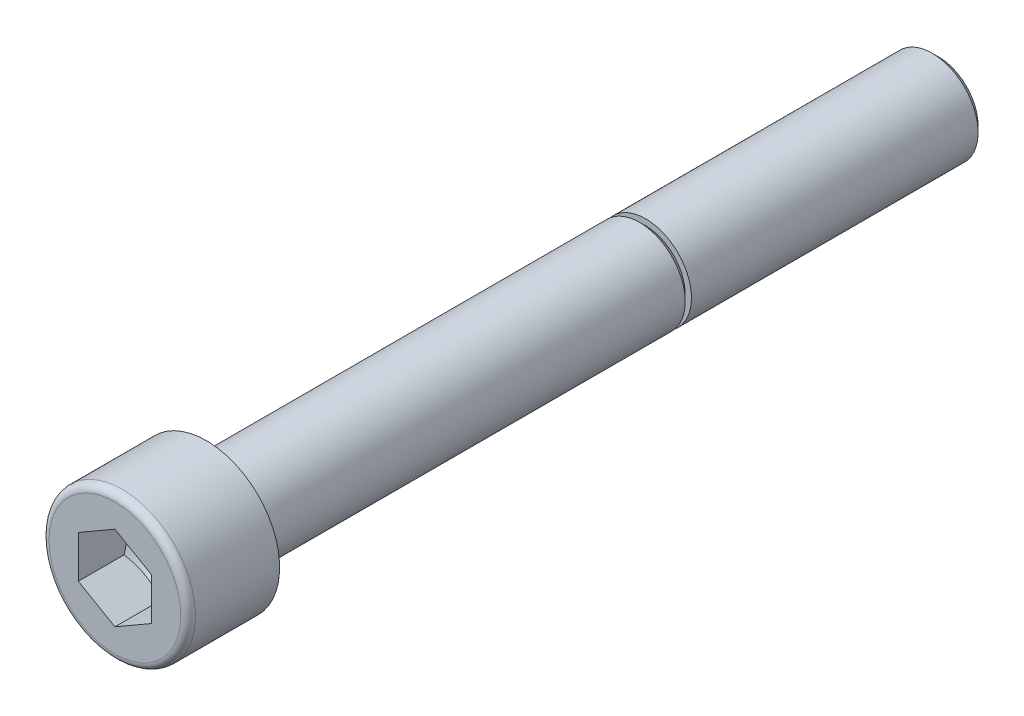
ISO-10303-21;
HEADER;
FILE_DESCRIPTION(('STEP AP214'),'2;1');
FILE_NAME('part.step','',(''),(''),'','','');
FILE_SCHEMA(('AUTOMOTIVE_DESIGN { 1 0 10303 214 1 1 1 1 }'));
ENDSEC;
DATA;
#1=APPLICATION_CONTEXT('core data for automotive mechanical design processes');
#2=APPLICATION_PROTOCOL_DEFINITION('international standard','automotive_design',2000,#1);
#3=PRODUCT_CONTEXT('',#1,'mechanical');
#4=PRODUCT('Part','Part','',(#3));
#5=PRODUCT_RELATED_PRODUCT_CATEGORY('part','',(#4));
#6=PRODUCT_DEFINITION_FORMATION('','',#4);
#7=PRODUCT_DEFINITION_CONTEXT('part definition',#1,'design');
#8=PRODUCT_DEFINITION('design','',#6,#7);
#9=PRODUCT_DEFINITION_SHAPE('','',#8);
#10=(LENGTH_UNIT() NAMED_UNIT(*) SI_UNIT(.MILLI.,.METRE.));
#11=(NAMED_UNIT(*) PLANE_ANGLE_UNIT() SI_UNIT($,.RADIAN.));
#12=(NAMED_UNIT(*) SI_UNIT($,.STERADIAN.) SOLID_ANGLE_UNIT());
#13=UNCERTAINTY_MEASURE_WITH_UNIT(LENGTH_MEASURE(1.E-05),#10,'distance_accuracy_value','');
#14=(GEOMETRIC_REPRESENTATION_CONTEXT(3) GLOBAL_UNCERTAINTY_ASSIGNED_CONTEXT((#13)) GLOBAL_UNIT_ASSIGNED_CONTEXT((#10,
#11,#12)) REPRESENTATION_CONTEXT('',''));
#15=CARTESIAN_POINT('',(0.,0.,0.));
#16=DIRECTION('',(0.,0.,1.));
#17=DIRECTION('',(1.,0.,0.));
#18=AXIS2_PLACEMENT_3D('',#15,#16,#17);
#19=CARTESIAN_POINT('',(-4.,0.,0.));
#20=DIRECTION('',(0.,0.,-1.));
#21=DIRECTION('',(-1.,0.,0.));
#22=AXIS2_PLACEMENT_3D('',#19,#20,#21);
#23=PLANE('',#22);
#24=CARTESIAN_POINT('',(0.,0.,0.));
#25=DIRECTION('',(0.,0.,-1.));
#26=DIRECTION('',(-1.,0.,0.));
#27=AXIS2_PLACEMENT_3D('',#24,#25,#26);
#28=CIRCLE('',#27,8.);
#29=CARTESIAN_POINT('',(-8.,0.,0.));
#30=VERTEX_POINT('',#29);
#31=EDGE_CURVE('E11',#30,#30,#28,.T.);
#32=ORIENTED_EDGE('',*,*,#31,.T.);
#33=EDGE_LOOP('',(#32));
#34=FACE_BOUND('',#33,.T.);
#35=CARTESIAN_POINT('',(0.,0.,0.));
#36=DIRECTION('',(0.,0.,1.));
#37=DIRECTION('',(-1.,0.,0.));
#38=AXIS2_PLACEMENT_3D('',#35,#36,#37);
#39=CIRCLE('',#38,5.);
#40=CARTESIAN_POINT('',(5.,0.,0.));
#41=VERTEX_POINT('',#40);
#42=EDGE_CURVE('E146',#41,#41,#39,.T.);
#43=ORIENTED_EDGE('',*,*,#42,.T.);
#44=EDGE_LOOP('',(#43));
#45=FACE_BOUND('',#44,.T.);
#46=ADVANCED_FACE('F17',(#34,#45),#23,.T.);
#47=CARTESIAN_POINT('',(0.,0.,4.6));
#48=DIRECTION('',(0.,0.,1.));
#49=DIRECTION('',(-1.,0.,0.));
#50=AXIS2_PLACEMENT_3D('',#47,#48,#49);
#51=CYLINDRICAL_SURFACE('',#50,8.);
#52=CARTESIAN_POINT('',(0.,0.,9.2));
#53=DIRECTION('',(0.,0.,-1.));
#54=DIRECTION('',(-1.,0.,0.));
#55=AXIS2_PLACEMENT_3D('',#52,#53,#54);
#56=CIRCLE('',#55,8.);
#57=CARTESIAN_POINT('',(-8.,0.,9.2));
#58=VERTEX_POINT('',#57);
#59=EDGE_CURVE('E27',#58,#58,#56,.T.);
#60=ORIENTED_EDGE('',*,*,#59,.T.);
#61=EDGE_LOOP('',(#60));
#62=FACE_BOUND('',#61,.T.);
#63=ORIENTED_EDGE('',*,*,#31,.F.);
#64=EDGE_LOOP('',(#63));
#65=FACE_BOUND('',#64,.T.);
#66=ADVANCED_FACE('F220',(#62,#65),#51,.T.);
#67=CARTESIAN_POINT('',(0.,0.,9.2));
#68=DIRECTION('',(0.,0.,-1.));
#69=DIRECTION('',(0.,-1.,0.));
#70=AXIS2_PLACEMENT_3D('',#67,#68,#69);
#71=TOROIDAL_SURFACE('',#70,7.2,0.8);
#72=CARTESIAN_POINT('',(0.,0.,10.));
#73=DIRECTION('',(0.,0.,-1.));
#74=DIRECTION('',(-1.,0.,0.));
#75=AXIS2_PLACEMENT_3D('',#72,#73,#74);
#76=CIRCLE('',#75,7.2);
#77=CARTESIAN_POINT('',(-7.2,0.,10.));
#78=VERTEX_POINT('',#77);
#79=EDGE_CURVE('E165',#78,#78,#76,.T.);
#80=ORIENTED_EDGE('',*,*,#79,.T.);
#81=EDGE_LOOP('',(#80));
#82=FACE_BOUND('',#81,.T.);
#83=ORIENTED_EDGE('',*,*,#59,.F.);
#84=EDGE_LOOP('',(#83));
#85=FACE_BOUND('',#84,.T.);
#86=ADVANCED_FACE('F225',(#82,#85),#71,.T.);
#87=CARTESIAN_POINT('',(-3.6,0.,10.));
#88=DIRECTION('',(0.,0.,1.));
#89=DIRECTION('',(1.,0.,0.));
#90=AXIS2_PLACEMENT_3D('',#87,#88,#89);
#91=PLANE('',#90);
#92=ORIENTED_EDGE('',*,*,#79,.F.);
#93=EDGE_LOOP('',(#92));
#94=FACE_BOUND('',#93,.T.);
#95=DIRECTION('',(-0.866025403784439,-0.5,0.));
#96=VECTOR('',#95,1.);
#97=CARTESIAN_POINT('',(0.649999067499783,-4.24352286340599,10.));
#98=LINE('',#97,#96);
#99=CARTESIAN_POINT('',(3.99999813499956,-2.3094,10.));
#100=VERTEX_POINT('',#99);
#101=CARTESIAN_POINT('',(0.,-4.6188,10.));
#102=VERTEX_POINT('',#101);
#103=EDGE_CURVE('E108',#100,#102,#98,.T.);
#104=ORIENTED_EDGE('',*,*,#103,.T.);
#105=DIRECTION('',(-0.866025403784439,0.5,0.));
#106=VECTOR('',#105,1.);
#107=CARTESIAN_POINT('',(-3.34999906749979,-2.684677136594,10.));
#108=LINE('',#107,#106);
#109=CARTESIAN_POINT('',(-3.99999813499956,-2.3094,10.));
#110=VERTEX_POINT('',#109);
#111=EDGE_CURVE('E95',#102,#110,#108,.T.);
#112=ORIENTED_EDGE('',*,*,#111,.T.);
#113=DIRECTION('',(0.,1.,0.));
#114=VECTOR('',#113,1.);
#115=CARTESIAN_POINT('',(-3.99999813499956,0.,10.));
#116=LINE('',#115,#114);
#117=CARTESIAN_POINT('',(-3.99999813499956,2.3094,10.));
#118=VERTEX_POINT('',#117);
#119=EDGE_CURVE('E174',#110,#118,#116,.T.);
#120=ORIENTED_EDGE('',*,*,#119,.T.);
#121=DIRECTION('',(0.866025403784439,0.5,0.));
#122=VECTOR('',#121,1.);
#123=CARTESIAN_POINT('',(-3.34999906749978,2.684677136594,10.));
#124=LINE('',#123,#122);
#125=CARTESIAN_POINT('',(0.,4.6188,10.));
#126=VERTEX_POINT('',#125);
#127=EDGE_CURVE('E152',#118,#126,#124,.T.);
#128=ORIENTED_EDGE('',*,*,#127,.T.);
#129=DIRECTION('',(0.866025403784439,-0.5,0.));
#130=VECTOR('',#129,1.);
#131=CARTESIAN_POINT('',(0.649999067499783,4.24352286340599,10.));
#132=LINE('',#131,#130);
#133=CARTESIAN_POINT('',(3.99999813499956,2.3094,10.));
#134=VERTEX_POINT('',#133);
#135=EDGE_CURVE('E153',#126,#134,#132,.T.);
#136=ORIENTED_EDGE('',*,*,#135,.T.);
#137=DIRECTION('',(0.,-1.,0.));
#138=VECTOR('',#137,1.);
#139=CARTESIAN_POINT('',(3.99999813499956,0.,10.));
#140=LINE('',#139,#138);
#141=EDGE_CURVE('E110',#134,#100,#140,.T.);
#142=ORIENTED_EDGE('',*,*,#141,.T.);
#143=EDGE_LOOP('',(#104,#112,#120,#128,#136,#142));
#144=FACE_BOUND('',#143,.T.);
#145=ADVANCED_FACE('F19',(#94,#144),#91,.T.);
#146=CARTESIAN_POINT('',(-2.16171875,0.,-80.));
#147=DIRECTION('',(0.,0.,-1.));
#148=DIRECTION('',(-1.,0.,0.));
#149=AXIS2_PLACEMENT_3D('',#146,#147,#148);
#150=PLANE('',#149);
#151=CARTESIAN_POINT('',(0.,0.,-80.));
#152=DIRECTION('',(0.,0.,-1.));
#153=DIRECTION('',(-1.,0.,0.));
#154=AXIS2_PLACEMENT_3D('',#151,#152,#153);
#155=CIRCLE('',#154,4.3234375);
#156=CARTESIAN_POINT('',(-4.3234375,0.,-80.));
#157=VERTEX_POINT('',#156);
#158=EDGE_CURVE('E161',#157,#157,#155,.T.);
#159=ORIENTED_EDGE('',*,*,#158,.T.);
#160=EDGE_LOOP('',(#159));
#161=FACE_BOUND('',#160,.T.);
#162=ADVANCED_FACE('F285',(#161),#150,.T.);
#163=CARTESIAN_POINT('',(0.,0.,-79.66171875));
#164=DIRECTION('',(0.,0.,1.));
#165=DIRECTION('',(-1.,0.,0.));
#166=AXIS2_PLACEMENT_3D('',#163,#164,#165);
#167=CONICAL_SURFACE('',#166,4.66171875,0.785398163397446);
#168=CARTESIAN_POINT('',(0.,0.,-79.3234375));
#169=DIRECTION('',(0.,0.,-1.));
#170=DIRECTION('',(-1.,0.,0.));
#171=AXIS2_PLACEMENT_3D('',#168,#169,#170);
#172=CIRCLE('',#171,5.);
#173=CARTESIAN_POINT('',(-5.,0.,-79.3234375));
#174=VERTEX_POINT('',#173);
#175=EDGE_CURVE('E148',#174,#174,#172,.T.);
#176=ORIENTED_EDGE('',*,*,#175,.T.);
#177=EDGE_LOOP('',(#176));
#178=FACE_BOUND('',#177,.T.);
#179=ORIENTED_EDGE('',*,*,#158,.F.);
#180=EDGE_LOOP('',(#179));
#181=FACE_BOUND('',#180,.T.);
#182=ADVANCED_FACE('F281',(#178,#181),#167,.T.);
#183=CARTESIAN_POINT('',(0.,0.,-63.66171875));
#184=DIRECTION('',(0.,0.,1.));
#185=DIRECTION('',(-1.,0.,0.));
#186=AXIS2_PLACEMENT_3D('',#183,#184,#185);
#187=CYLINDRICAL_SURFACE('',#186,5.);
#188=CARTESIAN_POINT('',(0.,0.,-48.));
#189=DIRECTION('',(0.,0.,-1.));
#190=DIRECTION('',(-1.,0.,0.));
#191=AXIS2_PLACEMENT_3D('',#188,#189,#190);
#192=CIRCLE('',#191,5.);
#193=CARTESIAN_POINT('',(-5.,0.,-48.));
#194=VERTEX_POINT('',#193);
#195=EDGE_CURVE('E145',#194,#194,#192,.T.);
#196=ORIENTED_EDGE('',*,*,#195,.T.);
#197=EDGE_LOOP('',(#196));
#198=FACE_BOUND('',#197,.T.);
#199=ORIENTED_EDGE('',*,*,#175,.F.);
#200=EDGE_LOOP('',(#199));
#201=FACE_BOUND('',#200,.T.);
#202=ADVANCED_FACE('F284',(#198,#201),#187,.T.);
#203=CARTESIAN_POINT('',(-4.66171875,0.,-48.));
#204=DIRECTION('',(0.,0.,1.));
#205=DIRECTION('',(1.,0.,0.));
#206=AXIS2_PLACEMENT_3D('',#203,#204,#205);
#207=PLANE('',#206);
#208=CARTESIAN_POINT('',(0.,0.,-48.));
#209=DIRECTION('',(0.,0.,-1.));
#210=DIRECTION('',(-1.,0.,0.));
#211=AXIS2_PLACEMENT_3D('',#208,#209,#210);
#212=CIRCLE('',#211,4.3234375);
#213=CARTESIAN_POINT('',(-4.3234375,0.,-48.));
#214=VERTEX_POINT('',#213);
#215=EDGE_CURVE('E139',#214,#214,#212,.T.);
#216=ORIENTED_EDGE('',*,*,#215,.T.);
#217=EDGE_LOOP('',(#216));
#218=FACE_BOUND('',#217,.T.);
#219=ORIENTED_EDGE('',*,*,#195,.F.);
#220=EDGE_LOOP('',(#219));
#221=FACE_BOUND('',#220,.T.);
#222=ADVANCED_FACE('F231',(#218,#221),#207,.T.);
#223=CARTESIAN_POINT('',(0.,0.,-47.66171875));
#224=DIRECTION('',(0.,0.,1.));
#225=DIRECTION('',(-1.,0.,0.));
#226=AXIS2_PLACEMENT_3D('',#223,#224,#225);
#227=CONICAL_SURFACE('',#226,4.66171875,0.785398163397446);
#228=CARTESIAN_POINT('',(0.,0.,-47.3234375));
#229=DIRECTION('',(0.,0.,-1.));
#230=DIRECTION('',(-1.,0.,0.));
#231=AXIS2_PLACEMENT_3D('',#228,#229,#230);
#232=CIRCLE('',#231,5.);
#233=CARTESIAN_POINT('',(-5.,0.,-47.3234375));
#234=VERTEX_POINT('',#233);
#235=EDGE_CURVE('E105',#234,#234,#232,.T.);
#236=ORIENTED_EDGE('',*,*,#235,.T.);
#237=EDGE_LOOP('',(#236));
#238=FACE_BOUND('',#237,.T.);
#239=ORIENTED_EDGE('',*,*,#215,.F.);
#240=EDGE_LOOP('',(#239));
#241=FACE_BOUND('',#240,.T.);
#242=ADVANCED_FACE('F232',(#238,#241),#227,.T.);
#243=CARTESIAN_POINT('',(0.,0.,-23.16171875));
#244=DIRECTION('',(0.,0.,1.));
#245=DIRECTION('',(-1.,0.,0.));
#246=AXIS2_PLACEMENT_3D('',#243,#244,#245);
#247=CYLINDRICAL_SURFACE('',#246,5.);
#248=ORIENTED_EDGE('',*,*,#42,.F.);
#249=EDGE_LOOP('',(#248));
#250=FACE_BOUND('',#249,.T.);
#251=ORIENTED_EDGE('',*,*,#235,.F.);
#252=EDGE_LOOP('',(#251));
#253=FACE_BOUND('',#252,.T.);
#254=ADVANCED_FACE('F235',(#250,#253),#247,.T.);
#255=CARTESIAN_POINT('',(-1.99999906749978,-3.4641,10.));
#256=DIRECTION('',(-0.5,-0.866025403784439,0.));
#257=DIRECTION('',(-0.866025403784439,0.5,0.));
#258=AXIS2_PLACEMENT_3D('',#255,#256,#257);
#259=PLANE('',#258);
#260=CARTESIAN_POINT('',(0.,-4.6188,5.));
#261=CARTESIAN_POINT('',(-1.99999906749979,-3.4641,4.33333364416674));
#262=CARTESIAN_POINT('',(-3.99999813499956,-2.3094,5.));
#263=(BOUNDED_CURVE() B_SPLINE_CURVE(2,(#260,#261,#262),.UNSPECIFIED.,.F.,
.F.) B_SPLINE_CURVE_WITH_KNOTS((3,3),(0.,4.67374237317777),
.UNSPECIFIED.) CURVE() GEOMETRIC_REPRESENTATION_ITEM() RATIONAL_B_SPLINE_CURVE((1.,
1.15470053837925,1.)) REPRESENTATION_ITEM(''));
#264=CARTESIAN_POINT('',(0.,-4.6188,5.));
#265=VERTEX_POINT('',#264);
#266=CARTESIAN_POINT('',(-3.99999813499956,-2.3094,5.));
#267=VERTEX_POINT('',#266);
#268=EDGE_CURVE('E178',#265,#267,#263,.T.);
#269=ORIENTED_EDGE('',*,*,#268,.T.);
#270=DIRECTION('',(0.,0.,-1.));
#271=VECTOR('',#270,1.);
#272=CARTESIAN_POINT('',(-3.99999813499956,-2.3094,10.));
#273=LINE('',#272,#271);
#274=EDGE_CURVE('E21',#110,#267,#273,.T.);
#275=ORIENTED_EDGE('',*,*,#274,.F.);
#276=ORIENTED_EDGE('',*,*,#111,.F.);
#277=DIRECTION('',(0.,0.,-1.));
#278=VECTOR('',#277,1.);
#279=CARTESIAN_POINT('',(0.,-4.6188,10.));
#280=LINE('',#279,#278);
#281=EDGE_CURVE('E100',#102,#265,#280,.T.);
#282=ORIENTED_EDGE('',*,*,#281,.T.);
#283=EDGE_LOOP('',(#269,#275,#276,#282));
#284=FACE_BOUND('',#283,.T.);
#285=ADVANCED_FACE('F98',(#284),#259,.F.);
#286=CARTESIAN_POINT('',(-3.99999813499956,0.,10.));
#287=DIRECTION('',(-1.,0.,0.));
#288=DIRECTION('',(0.,1.,0.));
#289=AXIS2_PLACEMENT_3D('',#286,#287,#288);
#290=PLANE('',#289);
#291=CARTESIAN_POINT('',(-3.99999813499956,-2.3094,5.));
#292=CARTESIAN_POINT('',(-3.99999813499957,0.,4.33333364416674));
#293=CARTESIAN_POINT('',(-3.99999813499956,2.3094,5.));
#294=(BOUNDED_CURVE() B_SPLINE_CURVE(2,(#291,#292,#293),.UNSPECIFIED.,.F.,
.F.) B_SPLINE_CURVE_WITH_KNOTS((3,3),(0.,4.67374237317777),
.UNSPECIFIED.) CURVE() GEOMETRIC_REPRESENTATION_ITEM() RATIONAL_B_SPLINE_CURVE((1.,
1.15470053837925,1.)) REPRESENTATION_ITEM(''));
#295=CARTESIAN_POINT('',(-3.99999813499956,2.3094,5.));
#296=VERTEX_POINT('',#295);
#297=EDGE_CURVE('E132',#267,#296,#294,.T.);
#298=ORIENTED_EDGE('',*,*,#297,.T.);
#299=DIRECTION('',(0.,0.,-1.));
#300=VECTOR('',#299,1.);
#301=CARTESIAN_POINT('',(-3.99999813499956,2.3094,10.));
#302=LINE('',#301,#300);
#303=EDGE_CURVE('E47',#118,#296,#302,.T.);
#304=ORIENTED_EDGE('',*,*,#303,.F.);
#305=ORIENTED_EDGE('',*,*,#119,.F.);
#306=ORIENTED_EDGE('',*,*,#274,.T.);
#307=EDGE_LOOP('',(#298,#304,#305,#306));
#308=FACE_BOUND('',#307,.T.);
#309=ADVANCED_FACE('F203',(#308),#290,.F.);
#310=CARTESIAN_POINT('',(-1.99999906749978,3.4641,10.));
#311=DIRECTION('',(-0.5,0.866025403784439,0.));
#312=DIRECTION('',(0.866025403784439,0.5,0.));
#313=AXIS2_PLACEMENT_3D('',#310,#311,#312);
#314=PLANE('',#313);
#315=CARTESIAN_POINT('',(-3.99999813499956,2.3094,5.));
#316=CARTESIAN_POINT('',(-1.99999906749979,3.4641,4.33333364416674));
#317=CARTESIAN_POINT('',(0.,4.6188,5.));
#318=(BOUNDED_CURVE() B_SPLINE_CURVE(2,(#315,#316,#317),.UNSPECIFIED.,.F.,
.F.) B_SPLINE_CURVE_WITH_KNOTS((3,3),(0.,4.67374237317777),
.UNSPECIFIED.) CURVE() GEOMETRIC_REPRESENTATION_ITEM() RATIONAL_B_SPLINE_CURVE((1.,
1.15470053837925,1.)) REPRESENTATION_ITEM(''));
#319=CARTESIAN_POINT('',(0.,4.6188,5.));
#320=VERTEX_POINT('',#319);
#321=EDGE_CURVE('E129',#296,#320,#318,.T.);
#322=ORIENTED_EDGE('',*,*,#321,.T.);
#323=DIRECTION('',(0.,0.,-1.));
#324=VECTOR('',#323,1.);
#325=CARTESIAN_POINT('',(0.,4.6188,10.));
#326=LINE('',#325,#324);
#327=EDGE_CURVE('E150',#126,#320,#326,.T.);
#328=ORIENTED_EDGE('',*,*,#327,.F.);
#329=ORIENTED_EDGE('',*,*,#127,.F.);
#330=ORIENTED_EDGE('',*,*,#303,.T.);
#331=EDGE_LOOP('',(#322,#328,#329,#330));
#332=FACE_BOUND('',#331,.T.);
#333=ADVANCED_FACE('F204',(#332),#314,.F.);
#334=CARTESIAN_POINT('',(1.99999906749978,3.4641,10.));
#335=DIRECTION('',(0.5,0.866025403784439,0.));
#336=DIRECTION('',(0.866025403784439,-0.5,0.));
#337=AXIS2_PLACEMENT_3D('',#334,#335,#336);
#338=PLANE('',#337);
#339=CARTESIAN_POINT('',(0.,4.6188,5.));
#340=CARTESIAN_POINT('',(1.99999906749978,3.4641,4.33333364416675));
#341=CARTESIAN_POINT('',(3.99999813499956,2.3094,5.));
#342=(BOUNDED_CURVE() B_SPLINE_CURVE(2,(#339,#340,#341),.UNSPECIFIED.,.F.,
.F.) B_SPLINE_CURVE_WITH_KNOTS((3,3),(0.,4.67374237317776),
.UNSPECIFIED.) CURVE() GEOMETRIC_REPRESENTATION_ITEM() RATIONAL_B_SPLINE_CURVE((1.,
1.15470053837925,1.)) REPRESENTATION_ITEM(''));
#343=CARTESIAN_POINT('',(3.99999813499956,2.3094,5.));
#344=VERTEX_POINT('',#343);
#345=EDGE_CURVE('E119',#320,#344,#342,.T.);
#346=ORIENTED_EDGE('',*,*,#345,.T.);
#347=DIRECTION('',(0.,0.,-1.));
#348=VECTOR('',#347,1.);
#349=CARTESIAN_POINT('',(3.99999813499956,2.3094,10.));
#350=LINE('',#349,#348);
#351=EDGE_CURVE('E157',#134,#344,#350,.T.);
#352=ORIENTED_EDGE('',*,*,#351,.F.);
#353=ORIENTED_EDGE('',*,*,#135,.F.);
#354=ORIENTED_EDGE('',*,*,#327,.T.);
#355=EDGE_LOOP('',(#346,#352,#353,#354));
#356=FACE_BOUND('',#355,.T.);
#357=ADVANCED_FACE('F206',(#356),#338,.F.);
#358=CARTESIAN_POINT('',(3.99999813499956,0.,10.));
#359=DIRECTION('',(1.,0.,0.));
#360=DIRECTION('',(0.,-1.,0.));
#361=AXIS2_PLACEMENT_3D('',#358,#359,#360);
#362=PLANE('',#361);
#363=CARTESIAN_POINT('',(3.99999813499956,2.3094,5.));
#364=CARTESIAN_POINT('',(3.99999813499957,0.,4.33333364416674));
#365=CARTESIAN_POINT('',(3.99999813499956,-2.3094,5.));
#366=(BOUNDED_CURVE() B_SPLINE_CURVE(2,(#363,#364,#365),.UNSPECIFIED.,.F.,
.F.) B_SPLINE_CURVE_WITH_KNOTS((3,3),(0.,4.67374237317777),
.UNSPECIFIED.) CURVE() GEOMETRIC_REPRESENTATION_ITEM() RATIONAL_B_SPLINE_CURVE((1.,
1.15470053837925,1.)) REPRESENTATION_ITEM(''));
#367=CARTESIAN_POINT('',(3.99999813499956,-2.3094,5.));
#368=VERTEX_POINT('',#367);
#369=EDGE_CURVE('E122',#344,#368,#366,.T.);
#370=ORIENTED_EDGE('',*,*,#369,.T.);
#371=DIRECTION('',(0.,0.,-1.));
#372=VECTOR('',#371,1.);
#373=CARTESIAN_POINT('',(3.99999813499956,-2.3094,10.));
#374=LINE('',#373,#372);
#375=EDGE_CURVE('E113',#100,#368,#374,.T.);
#376=ORIENTED_EDGE('',*,*,#375,.F.);
#377=ORIENTED_EDGE('',*,*,#141,.F.);
#378=ORIENTED_EDGE('',*,*,#351,.T.);
#379=EDGE_LOOP('',(#370,#376,#377,#378));
#380=FACE_BOUND('',#379,.T.);
#381=ADVANCED_FACE('F208',(#380),#362,.F.);
#382=CARTESIAN_POINT('',(1.99999906749978,-3.4641,10.));
#383=DIRECTION('',(0.5,-0.866025403784439,0.));
#384=DIRECTION('',(-0.866025403784439,-0.5,0.));
#385=AXIS2_PLACEMENT_3D('',#382,#383,#384);
#386=PLANE('',#385);
#387=CARTESIAN_POINT('',(3.99999813499956,-2.3094,5.));
#388=CARTESIAN_POINT('',(1.99999906749978,-3.4641,4.33333364416675));
#389=CARTESIAN_POINT('',(0.,-4.6188,5.));
#390=(BOUNDED_CURVE() B_SPLINE_CURVE(2,(#387,#388,#389),.UNSPECIFIED.,.F.,
.F.) B_SPLINE_CURVE_WITH_KNOTS((3,3),(0.,4.67374237317777),
.UNSPECIFIED.) CURVE() GEOMETRIC_REPRESENTATION_ITEM() RATIONAL_B_SPLINE_CURVE((1.,
1.15470053837925,1.)) REPRESENTATION_ITEM(''));
#391=EDGE_CURVE('E117',#368,#265,#390,.T.);
#392=ORIENTED_EDGE('',*,*,#391,.T.);
#393=ORIENTED_EDGE('',*,*,#281,.F.);
#394=ORIENTED_EDGE('',*,*,#103,.F.);
#395=ORIENTED_EDGE('',*,*,#375,.T.);
#396=EDGE_LOOP('',(#392,#393,#394,#395));
#397=FACE_BOUND('',#396,.T.);
#398=ADVANCED_FACE('F115',(#397),#386,.F.);
#399=CARTESIAN_POINT('',(0.,0.,3.66666728833348));
#400=DIRECTION('',(0.,0.,1.));
#401=DIRECTION('',(-1.,0.,0.));
#402=AXIS2_PLACEMENT_3D('',#399,#400,#401);
#403=CONICAL_SURFACE('',#402,2.3094,1.0471975511966);
#404=CARTESIAN_POINT('',(0.,0.,2.33333457666696));
#405=VERTEX_POINT('',#404);
#406=VERTEX_LOOP('',#405);
#407=FACE_BOUND('',#406,.T.);
#408=ORIENTED_EDGE('',*,*,#321,.F.);
#409=ORIENTED_EDGE('',*,*,#297,.F.);
#410=ORIENTED_EDGE('',*,*,#268,.F.);
#411=ORIENTED_EDGE('',*,*,#391,.F.);
#412=ORIENTED_EDGE('',*,*,#369,.F.);
#413=ORIENTED_EDGE('',*,*,#345,.F.);
#414=EDGE_LOOP('',(#408,#409,#410,#411,#412,#413));
#415=FACE_BOUND('',#414,.T.);
#416=ADVANCED_FACE('F200',(#407,#415),#403,.F.);
#417=CLOSED_SHELL('',(#46,#66,#86,#145,#162,#182,#202,#222,#242,#254,#285,#309,#333,#357,#381,
#398,#416));
#418=MANIFOLD_SOLID_BREP('B1',#417);
#419=ADVANCED_BREP_SHAPE_REPRESENTATION('',(#18,#418),#14);
#420=SHAPE_DEFINITION_REPRESENTATION(#9,#419);
ENDSEC;
END-ISO-10303-21;
